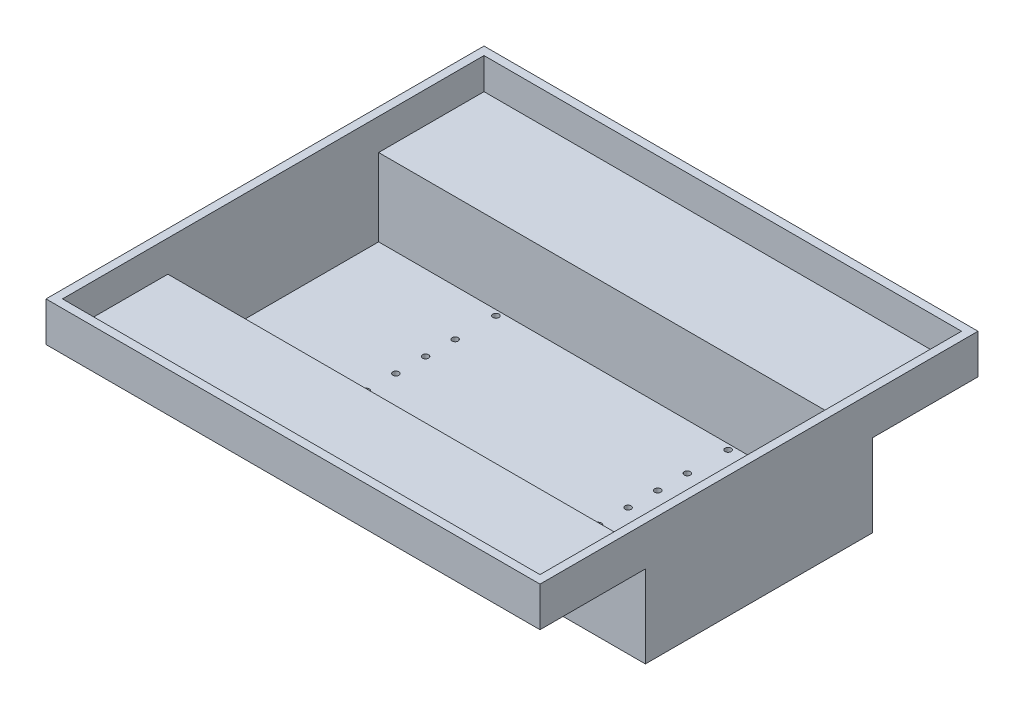
ISO-10303-21;
HEADER;
FILE_DESCRIPTION(('STEP AP214'),'2;1');
FILE_NAME('part.step','',(''),(''),'','','');
FILE_SCHEMA(('AUTOMOTIVE_DESIGN { 1 0 10303 214 1 1 1 1 }'));
ENDSEC;
DATA;
#1=APPLICATION_CONTEXT('core data for automotive mechanical design processes');
#2=APPLICATION_PROTOCOL_DEFINITION('international standard','automotive_design',2000,#1);
#3=PRODUCT_CONTEXT('',#1,'mechanical');
#4=PRODUCT('Part','Part','',(#3));
#5=PRODUCT_RELATED_PRODUCT_CATEGORY('part','',(#4));
#6=PRODUCT_DEFINITION_FORMATION('','',#4);
#7=PRODUCT_DEFINITION_CONTEXT('part definition',#1,'design');
#8=PRODUCT_DEFINITION('design','',#6,#7);
#9=PRODUCT_DEFINITION_SHAPE('','',#8);
#10=(LENGTH_UNIT() NAMED_UNIT(*) SI_UNIT(.MILLI.,.METRE.));
#11=(NAMED_UNIT(*) PLANE_ANGLE_UNIT() SI_UNIT($,.RADIAN.));
#12=(NAMED_UNIT(*) SI_UNIT($,.STERADIAN.) SOLID_ANGLE_UNIT());
#13=UNCERTAINTY_MEASURE_WITH_UNIT(LENGTH_MEASURE(1.E-05),#10,'distance_accuracy_value','');
#14=(GEOMETRIC_REPRESENTATION_CONTEXT(3) GLOBAL_UNCERTAINTY_ASSIGNED_CONTEXT((#13)) GLOBAL_UNIT_ASSIGNED_CONTEXT((#10,
#11,#12)) REPRESENTATION_CONTEXT('',''));
#15=CARTESIAN_POINT('',(0.,0.,0.));
#16=DIRECTION('',(0.,0.,1.));
#17=DIRECTION('',(1.,0.,0.));
#18=AXIS2_PLACEMENT_3D('',#15,#16,#17);
#19=CARTESIAN_POINT('',(150.,-42.,69.));
#20=DIRECTION('',(0.,1.,0.));
#21=DIRECTION('',(0.,0.,1.));
#22=AXIS2_PLACEMENT_3D('',#19,#20,#21);
#23=PLANE('',#22);
#24=CARTESIAN_POINT('',(-70.5000000000003,-42.,36.));
#25=DIRECTION('',(0.,1.,0.));
#26=DIRECTION('',(0.,0.,1.));
#27=AXIS2_PLACEMENT_3D('',#24,#25,#26);
#28=CIRCLE('',#27,1.85000000000001);
#29=CARTESIAN_POINT('',(-70.5000000000003,-42.,37.85));
#30=VERTEX_POINT('',#29);
#31=EDGE_CURVE('E45',#30,#30,#28,.T.);
#32=ORIENTED_EDGE('',*,*,#31,.F.);
#33=EDGE_LOOP('',(#32));
#34=FACE_BOUND('',#33,.T.);
#35=CARTESIAN_POINT('',(-70.5,-42.,60.75));
#36=DIRECTION('',(0.,1.,0.));
#37=DIRECTION('',(0.,0.,1.));
#38=AXIS2_PLACEMENT_3D('',#35,#36,#37);
#39=CIRCLE('',#38,1.85000000000001);
#40=CARTESIAN_POINT('',(-70.5,-42.,62.6));
#41=VERTEX_POINT('',#40);
#42=EDGE_CURVE('E351',#41,#41,#39,.T.);
#43=ORIENTED_EDGE('',*,*,#42,.F.);
#44=EDGE_LOOP('',(#43));
#45=FACE_BOUND('',#44,.T.);
#46=CARTESIAN_POINT('',(70.5,-42.,-60.75));
#47=DIRECTION('',(0.,1.,0.));
#48=DIRECTION('',(0.,0.,1.));
#49=AXIS2_PLACEMENT_3D('',#46,#47,#48);
#50=CIRCLE('',#49,1.85000000000001);
#51=CARTESIAN_POINT('',(70.5,-42.,-58.9));
#52=VERTEX_POINT('',#51);
#53=EDGE_CURVE('E348',#52,#52,#50,.T.);
#54=ORIENTED_EDGE('',*,*,#53,.F.);
#55=EDGE_LOOP('',(#54));
#56=FACE_BOUND('',#55,.T.);
#57=CARTESIAN_POINT('',(70.5000000000004,-42.,36.));
#58=DIRECTION('',(0.,1.,0.));
#59=DIRECTION('',(0.,0.,1.));
#60=AXIS2_PLACEMENT_3D('',#57,#58,#59);
#61=CIRCLE('',#60,1.85000000000001);
#62=CARTESIAN_POINT('',(70.5000000000004,-42.,37.85));
#63=VERTEX_POINT('',#62);
#64=EDGE_CURVE('E344',#63,#63,#61,.T.);
#65=ORIENTED_EDGE('',*,*,#64,.F.);
#66=EDGE_LOOP('',(#65));
#67=FACE_BOUND('',#66,.T.);
#68=CARTESIAN_POINT('',(70.5,-42.,60.75));
#69=DIRECTION('',(0.,1.,0.));
#70=DIRECTION('',(0.,0.,1.));
#71=AXIS2_PLACEMENT_3D('',#68,#69,#70);
#72=CIRCLE('',#71,1.85000000000001);
#73=CARTESIAN_POINT('',(70.5,-42.,62.6));
#74=VERTEX_POINT('',#73);
#75=EDGE_CURVE('E340',#74,#74,#72,.T.);
#76=ORIENTED_EDGE('',*,*,#75,.F.);
#77=EDGE_LOOP('',(#76));
#78=FACE_BOUND('',#77,.T.);
#79=CARTESIAN_POINT('',(70.4999999999999,-42.,-18.));
#80=DIRECTION('',(0.,1.,0.));
#81=DIRECTION('',(0.,0.,1.));
#82=AXIS2_PLACEMENT_3D('',#79,#80,#81);
#83=CIRCLE('',#82,1.85);
#84=CARTESIAN_POINT('',(70.4999999999999,-42.,-16.15));
#85=VERTEX_POINT('',#84);
#86=EDGE_CURVE('E336',#85,#85,#83,.T.);
#87=ORIENTED_EDGE('',*,*,#86,.F.);
#88=EDGE_LOOP('',(#87));
#89=FACE_BOUND('',#88,.T.);
#90=CARTESIAN_POINT('',(70.4999999999999,-42.,-36.));
#91=DIRECTION('',(0.,1.,0.));
#92=DIRECTION('',(0.,0.,1.));
#93=AXIS2_PLACEMENT_3D('',#90,#91,#92);
#94=CIRCLE('',#93,1.85000000000001);
#95=CARTESIAN_POINT('',(70.4999999999999,-42.,-34.15));
#96=VERTEX_POINT('',#95);
#97=EDGE_CURVE('E332',#96,#96,#94,.T.);
#98=ORIENTED_EDGE('',*,*,#97,.F.);
#99=EDGE_LOOP('',(#98));
#100=FACE_BOUND('',#99,.T.);
#101=CARTESIAN_POINT('',(70.5000000000002,-42.,18.));
#102=DIRECTION('',(0.,1.,0.));
#103=DIRECTION('',(0.,0.,1.));
#104=AXIS2_PLACEMENT_3D('',#101,#102,#103);
#105=CIRCLE('',#104,1.85);
#106=CARTESIAN_POINT('',(70.5000000000002,-42.,19.85));
#107=VERTEX_POINT('',#106);
#108=EDGE_CURVE('E328',#107,#107,#105,.T.);
#109=ORIENTED_EDGE('',*,*,#108,.F.);
#110=EDGE_LOOP('',(#109));
#111=FACE_BOUND('',#110,.T.);
#112=CARTESIAN_POINT('',(-70.5000000000002,-42.,18.));
#113=DIRECTION('',(0.,1.,0.));
#114=DIRECTION('',(0.,0.,1.));
#115=AXIS2_PLACEMENT_3D('',#112,#113,#114);
#116=CIRCLE('',#115,1.85);
#117=CARTESIAN_POINT('',(-70.5000000000002,-42.,19.85));
#118=VERTEX_POINT('',#117);
#119=EDGE_CURVE('E324',#118,#118,#116,.T.);
#120=ORIENTED_EDGE('',*,*,#119,.F.);
#121=EDGE_LOOP('',(#120));
#122=FACE_BOUND('',#121,.T.);
#123=CARTESIAN_POINT('',(-70.5,-42.,0.));
#124=DIRECTION('',(0.,1.,0.));
#125=DIRECTION('',(0.,0.,1.));
#126=AXIS2_PLACEMENT_3D('',#123,#124,#125);
#127=CIRCLE('',#126,1.85);
#128=CARTESIAN_POINT('',(-70.5,-42.,1.85));
#129=VERTEX_POINT('',#128);
#130=EDGE_CURVE('E320',#129,#129,#127,.T.);
#131=ORIENTED_EDGE('',*,*,#130,.F.);
#132=EDGE_LOOP('',(#131));
#133=FACE_BOUND('',#132,.T.);
#134=CARTESIAN_POINT('',(-70.4999999999999,-42.,-18.));
#135=DIRECTION('',(0.,1.,0.));
#136=DIRECTION('',(0.,0.,1.));
#137=AXIS2_PLACEMENT_3D('',#134,#135,#136);
#138=CIRCLE('',#137,1.85);
#139=CARTESIAN_POINT('',(-70.4999999999999,-42.,-16.15));
#140=VERTEX_POINT('',#139);
#141=EDGE_CURVE('E316',#140,#140,#138,.T.);
#142=ORIENTED_EDGE('',*,*,#141,.F.);
#143=EDGE_LOOP('',(#142));
#144=FACE_BOUND('',#143,.T.);
#145=CARTESIAN_POINT('',(-70.4999999999998,-42.,-36.));
#146=DIRECTION('',(0.,1.,0.));
#147=DIRECTION('',(0.,0.,1.));
#148=AXIS2_PLACEMENT_3D('',#145,#146,#147);
#149=CIRCLE('',#148,1.85000000000001);
#150=CARTESIAN_POINT('',(-70.4999999999998,-42.,-34.15));
#151=VERTEX_POINT('',#150);
#152=EDGE_CURVE('E312',#151,#151,#149,.T.);
#153=ORIENTED_EDGE('',*,*,#152,.F.);
#154=EDGE_LOOP('',(#153));
#155=FACE_BOUND('',#154,.T.);
#156=CARTESIAN_POINT('',(-70.5,-42.,-60.75));
#157=DIRECTION('',(0.,1.,0.));
#158=DIRECTION('',(0.,0.,1.));
#159=AXIS2_PLACEMENT_3D('',#156,#157,#158);
#160=CIRCLE('',#159,1.85000000000001);
#161=CARTESIAN_POINT('',(-70.5,-42.,-58.9));
#162=VERTEX_POINT('',#161);
#163=EDGE_CURVE('E307',#162,#162,#160,.T.);
#164=ORIENTED_EDGE('',*,*,#163,.F.);
#165=EDGE_LOOP('',(#164));
#166=FACE_BOUND('',#165,.T.);
#167=CARTESIAN_POINT('',(70.5,-42.,0.));
#168=DIRECTION('',(0.,1.,0.));
#169=DIRECTION('',(0.,0.,1.));
#170=AXIS2_PLACEMENT_3D('',#167,#168,#169);
#171=CIRCLE('',#170,1.85);
#172=CARTESIAN_POINT('',(70.5,-42.,1.85));
#173=VERTEX_POINT('',#172);
#174=EDGE_CURVE('E303',#173,#173,#171,.T.);
#175=ORIENTED_EDGE('',*,*,#174,.F.);
#176=EDGE_LOOP('',(#175));
#177=FACE_BOUND('',#176,.T.);
#178=DIRECTION('',(0.,0.,-1.));
#179=VECTOR('',#178,1.);
#180=CARTESIAN_POINT('',(-145.,-42.,0.));
#181=LINE('',#180,#179);
#182=CARTESIAN_POINT('',(-145.,-42.,64.));
#183=VERTEX_POINT('',#182);
#184=CARTESIAN_POINT('',(-145.,-42.,-64.));
#185=VERTEX_POINT('',#184);
#186=EDGE_CURVE('E242',#183,#185,#181,.T.);
#187=ORIENTED_EDGE('',*,*,#186,.F.);
#188=DIRECTION('',(-1.,0.,0.));
#189=VECTOR('',#188,1.);
#190=CARTESIAN_POINT('',(150.,-42.,64.));
#191=LINE('',#190,#189);
#192=CARTESIAN_POINT('',(145.,-42.,64.));
#193=VERTEX_POINT('',#192);
#194=EDGE_CURVE('E297',#193,#183,#191,.T.);
#195=ORIENTED_EDGE('',*,*,#194,.F.);
#196=DIRECTION('',(0.,0.,-1.));
#197=VECTOR('',#196,1.);
#198=CARTESIAN_POINT('',(145.,-42.,0.));
#199=LINE('',#198,#197);
#200=CARTESIAN_POINT('',(145.,-42.,-64.));
#201=VERTEX_POINT('',#200);
#202=EDGE_CURVE('E259',#193,#201,#199,.T.);
#203=ORIENTED_EDGE('',*,*,#202,.T.);
#204=DIRECTION('',(-1.,0.,0.));
#205=VECTOR('',#204,1.);
#206=CARTESIAN_POINT('',(150.,-42.,-64.));
#207=LINE('',#206,#205);
#208=EDGE_CURVE('E292',#201,#185,#207,.T.);
#209=ORIENTED_EDGE('',*,*,#208,.T.);
#210=EDGE_LOOP('',(#187,#195,#203,#209));
#211=FACE_BOUND('',#210,.T.);
#212=ADVANCED_FACE('F41',(#34,#45,#56,#67,#78,#89,#100,#111,#122,#133,#144,#155,#166,#177,#211),
#23,.T.);
#213=CARTESIAN_POINT('',(150.,0.,-64.));
#214=DIRECTION('',(0.,0.,1.));
#215=DIRECTION('',(1.,0.,0.));
#216=AXIS2_PLACEMENT_3D('',#213,#214,#215);
#217=PLANE('',#216);
#218=DIRECTION('',(0.,1.,0.));
#219=VECTOR('',#218,1.);
#220=CARTESIAN_POINT('',(-145.,0.,-64.));
#221=LINE('',#220,#219);
#222=CARTESIAN_POINT('',(-145.,5.00000000000006,-64.));
#223=VERTEX_POINT('',#222);
#224=EDGE_CURVE('E68',#185,#223,#221,.T.);
#225=ORIENTED_EDGE('',*,*,#224,.F.);
#226=ORIENTED_EDGE('',*,*,#208,.F.);
#227=DIRECTION('',(0.,1.,0.));
#228=VECTOR('',#227,1.);
#229=CARTESIAN_POINT('',(145.,0.,-64.));
#230=LINE('',#229,#228);
#231=CARTESIAN_POINT('',(145.,5.00000000000006,-64.));
#232=VERTEX_POINT('',#231);
#233=EDGE_CURVE('E256',#201,#232,#230,.T.);
#234=ORIENTED_EDGE('',*,*,#233,.T.);
#235=DIRECTION('',(-1.,0.,0.));
#236=VECTOR('',#235,1.);
#237=CARTESIAN_POINT('',(150.,5.00000000000006,-64.));
#238=LINE('',#237,#236);
#239=EDGE_CURVE('E286',#232,#223,#238,.T.);
#240=ORIENTED_EDGE('',*,*,#239,.T.);
#241=EDGE_LOOP('',(#225,#226,#234,#240));
#242=FACE_BOUND('',#241,.T.);
#243=ADVANCED_FACE('F365',(#242),#217,.T.);
#244=CARTESIAN_POINT('',(150.,5.00000000000005,-69.));
#245=DIRECTION('',(0.,1.,0.));
#246=DIRECTION('',(0.,0.,1.));
#247=AXIS2_PLACEMENT_3D('',#244,#245,#246);
#248=PLANE('',#247);
#249=DIRECTION('',(0.,0.,-1.));
#250=VECTOR('',#249,1.);
#251=CARTESIAN_POINT('',(-145.,5.00000000000011,0.));
#252=LINE('',#251,#250);
#253=CARTESIAN_POINT('',(-145.,5.00000000000001,-128.));
#254=VERTEX_POINT('',#253);
#255=EDGE_CURVE('E289',#223,#254,#252,.T.);
#256=ORIENTED_EDGE('',*,*,#255,.F.);
#257=ORIENTED_EDGE('',*,*,#239,.F.);
#258=DIRECTION('',(0.,0.,-1.));
#259=VECTOR('',#258,1.);
#260=CARTESIAN_POINT('',(145.,5.00000000000011,0.));
#261=LINE('',#260,#259);
#262=CARTESIAN_POINT('',(145.,5.00000000000001,-128.));
#263=VERTEX_POINT('',#262);
#264=EDGE_CURVE('E253',#232,#263,#261,.T.);
#265=ORIENTED_EDGE('',*,*,#264,.T.);
#266=DIRECTION('',(-1.,0.,0.));
#267=VECTOR('',#266,1.);
#268=CARTESIAN_POINT('',(150.,5.00000000000001,-128.));
#269=LINE('',#268,#267);
#270=EDGE_CURVE('E278',#263,#254,#269,.T.);
#271=ORIENTED_EDGE('',*,*,#270,.T.);
#272=EDGE_LOOP('',(#256,#257,#265,#271));
#273=FACE_BOUND('',#272,.T.);
#274=ADVANCED_FACE('F409',(#273),#248,.T.);
#275=CARTESIAN_POINT('',(150.,0.,-128.));
#276=DIRECTION('',(0.,0.,1.));
#277=DIRECTION('',(1.,0.,0.));
#278=AXIS2_PLACEMENT_3D('',#275,#276,#277);
#279=PLANE('',#278);
#280=DIRECTION('',(0.,1.,0.));
#281=VECTOR('',#280,1.);
#282=CARTESIAN_POINT('',(-145.,0.,-128.));
#283=LINE('',#282,#281);
#284=CARTESIAN_POINT('',(-145.,24.,-128.));
#285=VERTEX_POINT('',#284);
#286=EDGE_CURVE('E282',#254,#285,#283,.T.);
#287=ORIENTED_EDGE('',*,*,#286,.F.);
#288=ORIENTED_EDGE('',*,*,#270,.F.);
#289=DIRECTION('',(0.,1.,0.));
#290=VECTOR('',#289,1.);
#291=CARTESIAN_POINT('',(145.,0.,-128.));
#292=LINE('',#291,#290);
#293=CARTESIAN_POINT('',(145.,24.,-128.));
#294=VERTEX_POINT('',#293);
#295=EDGE_CURVE('E249',#263,#294,#292,.T.);
#296=ORIENTED_EDGE('',*,*,#295,.T.);
#297=DIRECTION('',(-1.,0.,0.));
#298=VECTOR('',#297,1.);
#299=CARTESIAN_POINT('',(-145.,24.,-128.));
#300=LINE('',#299,#298);
#301=EDGE_CURVE('E421',#294,#285,#300,.T.);
#302=ORIENTED_EDGE('',*,*,#301,.T.);
#303=EDGE_LOOP('',(#287,#288,#296,#302));
#304=FACE_BOUND('',#303,.T.);
#305=ADVANCED_FACE('F420',(#304),#279,.T.);
#306=CARTESIAN_POINT('',(150.,0.,128.));
#307=DIRECTION('',(0.,0.,-1.));
#308=DIRECTION('',(-1.,0.,0.));
#309=AXIS2_PLACEMENT_3D('',#306,#307,#308);
#310=PLANE('',#309);
#311=DIRECTION('',(0.,-1.,0.));
#312=VECTOR('',#311,1.);
#313=CARTESIAN_POINT('',(-145.,0.,128.));
#314=LINE('',#313,#312);
#315=CARTESIAN_POINT('',(-145.,24.,128.));
#316=VERTEX_POINT('',#315);
#317=CARTESIAN_POINT('',(-145.,4.99999999999998,128.));
#318=VERTEX_POINT('',#317);
#319=EDGE_CURVE('E59',#316,#318,#314,.T.);
#320=ORIENTED_EDGE('',*,*,#319,.F.);
#321=DIRECTION('',(1.,0.,0.));
#322=VECTOR('',#321,1.);
#323=CARTESIAN_POINT('',(145.,24.,128.));
#324=LINE('',#323,#322);
#325=CARTESIAN_POINT('',(145.,24.,128.));
#326=VERTEX_POINT('',#325);
#327=EDGE_CURVE('E427',#316,#326,#324,.T.);
#328=ORIENTED_EDGE('',*,*,#327,.T.);
#329=DIRECTION('',(0.,-1.,0.));
#330=VECTOR('',#329,1.);
#331=CARTESIAN_POINT('',(145.,0.,128.));
#332=LINE('',#331,#330);
#333=CARTESIAN_POINT('',(145.,4.99999999999998,128.));
#334=VERTEX_POINT('',#333);
#335=EDGE_CURVE('E246',#326,#334,#332,.T.);
#336=ORIENTED_EDGE('',*,*,#335,.T.);
#337=DIRECTION('',(-1.,0.,0.));
#338=VECTOR('',#337,1.);
#339=CARTESIAN_POINT('',(150.,4.99999999999998,128.));
#340=LINE('',#339,#338);
#341=EDGE_CURVE('E270',#334,#318,#340,.T.);
#342=ORIENTED_EDGE('',*,*,#341,.T.);
#343=EDGE_LOOP('',(#320,#328,#336,#342));
#344=FACE_BOUND('',#343,.T.);
#345=ADVANCED_FACE('F428',(#344),#310,.T.);
#346=CARTESIAN_POINT('',(150.,5.00000000000001,69.));
#347=DIRECTION('',(0.,1.,0.));
#348=DIRECTION('',(0.,0.,1.));
#349=AXIS2_PLACEMENT_3D('',#346,#347,#348);
#350=PLANE('',#349);
#351=DIRECTION('',(0.,0.,-1.));
#352=VECTOR('',#351,1.);
#353=CARTESIAN_POINT('',(-145.,5.00000000000005,0.));
#354=LINE('',#353,#352);
#355=CARTESIAN_POINT('',(-145.,5.00000000000002,64.));
#356=VERTEX_POINT('',#355);
#357=EDGE_CURVE('E273',#318,#356,#354,.T.);
#358=ORIENTED_EDGE('',*,*,#357,.F.);
#359=ORIENTED_EDGE('',*,*,#341,.F.);
#360=DIRECTION('',(0.,0.,-1.));
#361=VECTOR('',#360,1.);
#362=CARTESIAN_POINT('',(145.,5.00000000000005,0.));
#363=LINE('',#362,#361);
#364=CARTESIAN_POINT('',(145.,5.00000000000002,64.));
#365=VERTEX_POINT('',#364);
#366=EDGE_CURVE('E51',#334,#365,#363,.T.);
#367=ORIENTED_EDGE('',*,*,#366,.T.);
#368=DIRECTION('',(-1.,0.,0.));
#369=VECTOR('',#368,1.);
#370=CARTESIAN_POINT('',(150.,5.00000000000002,64.));
#371=LINE('',#370,#369);
#372=EDGE_CURVE('E263',#365,#356,#371,.T.);
#373=ORIENTED_EDGE('',*,*,#372,.T.);
#374=EDGE_LOOP('',(#358,#359,#367,#373));
#375=FACE_BOUND('',#374,.T.);
#376=ADVANCED_FACE('F557',(#375),#350,.T.);
#377=CARTESIAN_POINT('',(150.,0.,64.));
#378=DIRECTION('',(0.,0.,-1.));
#379=DIRECTION('',(-1.,0.,0.));
#380=AXIS2_PLACEMENT_3D('',#377,#378,#379);
#381=PLANE('',#380);
#382=DIRECTION('',(0.,-1.,0.));
#383=VECTOR('',#382,1.);
#384=CARTESIAN_POINT('',(-145.,0.,64.));
#385=LINE('',#384,#383);
#386=EDGE_CURVE('E267',#356,#183,#385,.T.);
#387=ORIENTED_EDGE('',*,*,#386,.F.);
#388=ORIENTED_EDGE('',*,*,#372,.F.);
#389=DIRECTION('',(0.,-1.,0.));
#390=VECTOR('',#389,1.);
#391=CARTESIAN_POINT('',(145.,0.,64.));
#392=LINE('',#391,#390);
#393=EDGE_CURVE('E11',#365,#193,#392,.T.);
#394=ORIENTED_EDGE('',*,*,#393,.T.);
#395=ORIENTED_EDGE('',*,*,#194,.T.);
#396=EDGE_LOOP('',(#387,#388,#394,#395));
#397=FACE_BOUND('',#396,.T.);
#398=ADVANCED_FACE('F399',(#397),#381,.T.);
#399=CARTESIAN_POINT('',(145.,0.,0.));
#400=DIRECTION('',(-1.,0.,0.));
#401=DIRECTION('',(0.,0.,1.));
#402=AXIS2_PLACEMENT_3D('',#399,#400,#401);
#403=PLANE('',#402);
#404=ORIENTED_EDGE('',*,*,#202,.F.);
#405=ORIENTED_EDGE('',*,*,#393,.F.);
#406=ORIENTED_EDGE('',*,*,#366,.F.);
#407=ORIENTED_EDGE('',*,*,#335,.F.);
#408=DIRECTION('',(0.,0.,-1.));
#409=VECTOR('',#408,1.);
#410=CARTESIAN_POINT('',(145.,24.,-128.));
#411=LINE('',#410,#409);
#412=EDGE_CURVE('E415',#326,#294,#411,.T.);
#413=ORIENTED_EDGE('',*,*,#412,.T.);
#414=ORIENTED_EDGE('',*,*,#295,.F.);
#415=ORIENTED_EDGE('',*,*,#264,.F.);
#416=ORIENTED_EDGE('',*,*,#233,.F.);
#417=EDGE_LOOP('',(#404,#405,#406,#407,#413,#414,#415,#416));
#418=FACE_BOUND('',#417,.T.);
#419=ADVANCED_FACE('F403',(#418),#403,.T.);
#420=CARTESIAN_POINT('',(-145.,0.,0.));
#421=DIRECTION('',(-1.,0.,0.));
#422=DIRECTION('',(0.,0.,1.));
#423=AXIS2_PLACEMENT_3D('',#420,#421,#422);
#424=PLANE('',#423);
#425=ORIENTED_EDGE('',*,*,#186,.T.);
#426=ORIENTED_EDGE('',*,*,#224,.T.);
#427=ORIENTED_EDGE('',*,*,#255,.T.);
#428=ORIENTED_EDGE('',*,*,#286,.T.);
#429=DIRECTION('',(0.,0.,1.));
#430=VECTOR('',#429,1.);
#431=CARTESIAN_POINT('',(-145.,24.,128.));
#432=LINE('',#431,#430);
#433=EDGE_CURVE('E431',#285,#316,#432,.T.);
#434=ORIENTED_EDGE('',*,*,#433,.T.);
#435=ORIENTED_EDGE('',*,*,#319,.T.);
#436=ORIENTED_EDGE('',*,*,#357,.T.);
#437=ORIENTED_EDGE('',*,*,#386,.T.);
#438=EDGE_LOOP('',(#425,#426,#427,#428,#434,#435,#436,#437));
#439=FACE_BOUND('',#438,.T.);
#440=ADVANCED_FACE('F43',(#439),#424,.F.);
#441=CARTESIAN_POINT('',(70.5,-50.,0.));
#442=DIRECTION('',(0.,1.,0.));
#443=DIRECTION('',(0.,0.,1.));
#444=AXIS2_PLACEMENT_3D('',#441,#442,#443);
#445=CYLINDRICAL_SURFACE('',#444,1.85);
#446=ORIENTED_EDGE('',*,*,#174,.T.);
#447=EDGE_LOOP('',(#446));
#448=FACE_BOUND('',#447,.T.);
#449=CARTESIAN_POINT('',(70.5,-50.,0.));
#450=DIRECTION('',(0.,1.,0.));
#451=DIRECTION('',(0.,0.,1.));
#452=AXIS2_PLACEMENT_3D('',#449,#450,#451);
#453=CIRCLE('',#452,1.85);
#454=CARTESIAN_POINT('',(70.5,-50.,1.85));
#455=VERTEX_POINT('',#454);
#456=EDGE_CURVE('E308',#455,#455,#453,.T.);
#457=ORIENTED_EDGE('',*,*,#456,.F.);
#458=EDGE_LOOP('',(#457));
#459=FACE_BOUND('',#458,.T.);
#460=ADVANCED_FACE('F566',(#448,#459),#445,.F.);
#461=CARTESIAN_POINT('',(-70.5,-50.,-60.75));
#462=DIRECTION('',(0.,1.,0.));
#463=DIRECTION('',(0.,0.,1.));
#464=AXIS2_PLACEMENT_3D('',#461,#462,#463);
#465=CYLINDRICAL_SURFACE('',#464,1.85000000000001);
#466=ORIENTED_EDGE('',*,*,#163,.T.);
#467=EDGE_LOOP('',(#466));
#468=FACE_BOUND('',#467,.T.);
#469=CARTESIAN_POINT('',(-70.5,-50.,-60.75));
#470=DIRECTION('',(0.,1.,0.));
#471=DIRECTION('',(0.,0.,-1.));
#472=AXIS2_PLACEMENT_3D('',#469,#470,#471);
#473=CIRCLE('',#472,1.85000000000001);
#474=CARTESIAN_POINT('',(-70.5,-50.,-62.6));
#475=VERTEX_POINT('',#474);
#476=EDGE_CURVE('E438',#475,#475,#473,.T.);
#477=ORIENTED_EDGE('',*,*,#476,.F.);
#478=EDGE_LOOP('',(#477));
#479=FACE_BOUND('',#478,.T.);
#480=ADVANCED_FACE('F570',(#468,#479),#465,.F.);
#481=CARTESIAN_POINT('',(-70.4999999999998,-50.,-36.));
#482=DIRECTION('',(0.,1.,0.));
#483=DIRECTION('',(0.,0.,1.));
#484=AXIS2_PLACEMENT_3D('',#481,#482,#483);
#485=CYLINDRICAL_SURFACE('',#484,1.85000000000001);
#486=ORIENTED_EDGE('',*,*,#152,.T.);
#487=EDGE_LOOP('',(#486));
#488=FACE_BOUND('',#487,.T.);
#489=CARTESIAN_POINT('',(-70.4999999999998,-50.,-36.));
#490=DIRECTION('',(0.,1.,0.));
#491=DIRECTION('',(0.,0.,-1.));
#492=AXIS2_PLACEMENT_3D('',#489,#490,#491);
#493=CIRCLE('',#492,1.85000000000001);
#494=CARTESIAN_POINT('',(-70.4999999999998,-50.,-37.85));
#495=VERTEX_POINT('',#494);
#496=EDGE_CURVE('E455',#495,#495,#493,.T.);
#497=ORIENTED_EDGE('',*,*,#496,.F.);
#498=EDGE_LOOP('',(#497));
#499=FACE_BOUND('',#498,.T.);
#500=ADVANCED_FACE('F576',(#488,#499),#485,.F.);
#501=CARTESIAN_POINT('',(-70.4999999999999,-50.,-18.));
#502=DIRECTION('',(0.,1.,0.));
#503=DIRECTION('',(0.,0.,1.));
#504=AXIS2_PLACEMENT_3D('',#501,#502,#503);
#505=CYLINDRICAL_SURFACE('',#504,1.85);
#506=ORIENTED_EDGE('',*,*,#141,.T.);
#507=EDGE_LOOP('',(#506));
#508=FACE_BOUND('',#507,.T.);
#509=CARTESIAN_POINT('',(-70.4999999999999,-50.,-18.));
#510=DIRECTION('',(0.,1.,0.));
#511=DIRECTION('',(0.,0.,-1.));
#512=AXIS2_PLACEMENT_3D('',#509,#510,#511);
#513=CIRCLE('',#512,1.85);
#514=CARTESIAN_POINT('',(-70.4999999999999,-50.,-19.85));
#515=VERTEX_POINT('',#514);
#516=EDGE_CURVE('E451',#515,#515,#513,.T.);
#517=ORIENTED_EDGE('',*,*,#516,.F.);
#518=EDGE_LOOP('',(#517));
#519=FACE_BOUND('',#518,.T.);
#520=ADVANCED_FACE('F613',(#508,#519),#505,.F.);
#521=CARTESIAN_POINT('',(-70.5,-50.,0.));
#522=DIRECTION('',(0.,1.,0.));
#523=DIRECTION('',(0.,0.,1.));
#524=AXIS2_PLACEMENT_3D('',#521,#522,#523);
#525=CYLINDRICAL_SURFACE('',#524,1.85);
#526=ORIENTED_EDGE('',*,*,#130,.T.);
#527=EDGE_LOOP('',(#526));
#528=FACE_BOUND('',#527,.T.);
#529=CARTESIAN_POINT('',(-70.5,-50.,0.));
#530=DIRECTION('',(0.,1.,0.));
#531=DIRECTION('',(0.,0.,-1.));
#532=AXIS2_PLACEMENT_3D('',#529,#530,#531);
#533=CIRCLE('',#532,1.85);
#534=CARTESIAN_POINT('',(-70.5,-50.,-1.85));
#535=VERTEX_POINT('',#534);
#536=EDGE_CURVE('E447',#535,#535,#533,.T.);
#537=ORIENTED_EDGE('',*,*,#536,.F.);
#538=EDGE_LOOP('',(#537));
#539=FACE_BOUND('',#538,.T.);
#540=ADVANCED_FACE('F617',(#528,#539),#525,.F.);
#541=CARTESIAN_POINT('',(-70.5000000000002,-50.,18.));
#542=DIRECTION('',(0.,1.,0.));
#543=DIRECTION('',(0.,0.,1.));
#544=AXIS2_PLACEMENT_3D('',#541,#542,#543);
#545=CYLINDRICAL_SURFACE('',#544,1.85);
#546=ORIENTED_EDGE('',*,*,#119,.T.);
#547=EDGE_LOOP('',(#546));
#548=FACE_BOUND('',#547,.T.);
#549=CARTESIAN_POINT('',(-70.5000000000002,-50.,18.));
#550=DIRECTION('',(0.,1.,0.));
#551=DIRECTION('',(0.,0.,-1.));
#552=AXIS2_PLACEMENT_3D('',#549,#550,#551);
#553=CIRCLE('',#552,1.85);
#554=CARTESIAN_POINT('',(-70.5000000000002,-50.,16.15));
#555=VERTEX_POINT('',#554);
#556=EDGE_CURVE('E442',#555,#555,#553,.T.);
#557=ORIENTED_EDGE('',*,*,#556,.F.);
#558=EDGE_LOOP('',(#557));
#559=FACE_BOUND('',#558,.T.);
#560=ADVANCED_FACE('F594',(#548,#559),#545,.F.);
#561=CARTESIAN_POINT('',(70.5000000000002,-50.,18.));
#562=DIRECTION('',(0.,1.,0.));
#563=DIRECTION('',(0.,0.,1.));
#564=AXIS2_PLACEMENT_3D('',#561,#562,#563);
#565=CYLINDRICAL_SURFACE('',#564,1.85);
#566=ORIENTED_EDGE('',*,*,#108,.T.);
#567=EDGE_LOOP('',(#566));
#568=FACE_BOUND('',#567,.T.);
#569=CARTESIAN_POINT('',(70.5000000000002,-50.,18.));
#570=DIRECTION('',(0.,1.,0.));
#571=DIRECTION('',(0.,0.,1.));
#572=AXIS2_PLACEMENT_3D('',#569,#570,#571);
#573=CIRCLE('',#572,1.85);
#574=CARTESIAN_POINT('',(70.5000000000002,-50.,19.85));
#575=VERTEX_POINT('',#574);
#576=EDGE_CURVE('E466',#575,#575,#573,.T.);
#577=ORIENTED_EDGE('',*,*,#576,.F.);
#578=EDGE_LOOP('',(#577));
#579=FACE_BOUND('',#578,.T.);
#580=ADVANCED_FACE('F591',(#568,#579),#565,.F.);
#581=CARTESIAN_POINT('',(70.4999999999999,-50.,-36.));
#582=DIRECTION('',(0.,1.,0.));
#583=DIRECTION('',(0.,0.,1.));
#584=AXIS2_PLACEMENT_3D('',#581,#582,#583);
#585=CYLINDRICAL_SURFACE('',#584,1.85000000000001);
#586=ORIENTED_EDGE('',*,*,#97,.T.);
#587=EDGE_LOOP('',(#586));
#588=FACE_BOUND('',#587,.T.);
#589=CARTESIAN_POINT('',(70.4999999999999,-50.,-36.));
#590=DIRECTION('',(0.,1.,0.));
#591=DIRECTION('',(0.,0.,1.));
#592=AXIS2_PLACEMENT_3D('',#589,#590,#591);
#593=CIRCLE('',#592,1.85000000000001);
#594=CARTESIAN_POINT('',(70.4999999999999,-50.,-34.15));
#595=VERTEX_POINT('',#594);
#596=EDGE_CURVE('E478',#595,#595,#593,.T.);
#597=ORIENTED_EDGE('',*,*,#596,.F.);
#598=EDGE_LOOP('',(#597));
#599=FACE_BOUND('',#598,.T.);
#600=ADVANCED_FACE('F585',(#588,#599),#585,.F.);
#601=CARTESIAN_POINT('',(70.4999999999999,-50.,-18.));
#602=DIRECTION('',(0.,1.,0.));
#603=DIRECTION('',(0.,0.,1.));
#604=AXIS2_PLACEMENT_3D('',#601,#602,#603);
#605=CYLINDRICAL_SURFACE('',#604,1.85);
#606=ORIENTED_EDGE('',*,*,#86,.T.);
#607=EDGE_LOOP('',(#606));
#608=FACE_BOUND('',#607,.T.);
#609=CARTESIAN_POINT('',(70.4999999999999,-50.,-18.));
#610=DIRECTION('',(0.,1.,0.));
#611=DIRECTION('',(0.,0.,1.));
#612=AXIS2_PLACEMENT_3D('',#609,#610,#611);
#613=CIRCLE('',#612,1.85);
#614=CARTESIAN_POINT('',(70.4999999999999,-50.,-16.15));
#615=VERTEX_POINT('',#614);
#616=EDGE_CURVE('E482',#615,#615,#613,.T.);
#617=ORIENTED_EDGE('',*,*,#616,.F.);
#618=EDGE_LOOP('',(#617));
#619=FACE_BOUND('',#618,.T.);
#620=ADVANCED_FACE('F581',(#608,#619),#605,.F.);
#621=CARTESIAN_POINT('',(70.5,-50.,60.75));
#622=DIRECTION('',(0.,1.,0.));
#623=DIRECTION('',(0.,0.,1.));
#624=AXIS2_PLACEMENT_3D('',#621,#622,#623);
#625=CYLINDRICAL_SURFACE('',#624,1.85000000000001);
#626=ORIENTED_EDGE('',*,*,#75,.T.);
#627=EDGE_LOOP('',(#626));
#628=FACE_BOUND('',#627,.T.);
#629=CARTESIAN_POINT('',(70.5,-50.,60.75));
#630=DIRECTION('',(0.,1.,0.));
#631=DIRECTION('',(0.,0.,1.));
#632=AXIS2_PLACEMENT_3D('',#629,#630,#631);
#633=CIRCLE('',#632,1.85000000000001);
#634=CARTESIAN_POINT('',(70.5,-50.,62.6));
#635=VERTEX_POINT('',#634);
#636=EDGE_CURVE('E486',#635,#635,#633,.T.);
#637=ORIENTED_EDGE('',*,*,#636,.F.);
#638=EDGE_LOOP('',(#637));
#639=FACE_BOUND('',#638,.T.);
#640=ADVANCED_FACE('F584',(#628,#639),#625,.F.);
#641=CARTESIAN_POINT('',(70.5000000000004,-50.,36.));
#642=DIRECTION('',(0.,1.,0.));
#643=DIRECTION('',(0.,0.,1.));
#644=AXIS2_PLACEMENT_3D('',#641,#642,#643);
#645=CYLINDRICAL_SURFACE('',#644,1.85000000000001);
#646=ORIENTED_EDGE('',*,*,#64,.T.);
#647=EDGE_LOOP('',(#646));
#648=FACE_BOUND('',#647,.T.);
#649=CARTESIAN_POINT('',(70.5000000000004,-50.,36.));
#650=DIRECTION('',(0.,1.,0.));
#651=DIRECTION('',(0.,0.,1.));
#652=AXIS2_PLACEMENT_3D('',#649,#650,#651);
#653=CIRCLE('',#652,1.85000000000001);
#654=CARTESIAN_POINT('',(70.5000000000004,-50.,37.85));
#655=VERTEX_POINT('',#654);
#656=EDGE_CURVE('E462',#655,#655,#653,.T.);
#657=ORIENTED_EDGE('',*,*,#656,.F.);
#658=EDGE_LOOP('',(#657));
#659=FACE_BOUND('',#658,.T.);
#660=ADVANCED_FACE('F589',(#648,#659),#645,.F.);
#661=CARTESIAN_POINT('',(70.5,-50.,-60.75));
#662=DIRECTION('',(0.,1.,0.));
#663=DIRECTION('',(0.,0.,1.));
#664=AXIS2_PLACEMENT_3D('',#661,#662,#663);
#665=CYLINDRICAL_SURFACE('',#664,1.85000000000001);
#666=ORIENTED_EDGE('',*,*,#53,.T.);
#667=EDGE_LOOP('',(#666));
#668=FACE_BOUND('',#667,.T.);
#669=CARTESIAN_POINT('',(70.5,-50.,-60.75));
#670=DIRECTION('',(0.,1.,0.));
#671=DIRECTION('',(0.,0.,1.));
#672=AXIS2_PLACEMENT_3D('',#669,#670,#671);
#673=CIRCLE('',#672,1.85000000000001);
#674=CARTESIAN_POINT('',(70.5,-50.,-58.9));
#675=VERTEX_POINT('',#674);
#676=EDGE_CURVE('E467',#675,#675,#673,.T.);
#677=ORIENTED_EDGE('',*,*,#676,.F.);
#678=EDGE_LOOP('',(#677));
#679=FACE_BOUND('',#678,.T.);
#680=ADVANCED_FACE('F604',(#668,#679),#665,.F.);
#681=CARTESIAN_POINT('',(-70.5,-50.,60.75));
#682=DIRECTION('',(0.,1.,0.));
#683=DIRECTION('',(0.,0.,1.));
#684=AXIS2_PLACEMENT_3D('',#681,#682,#683);
#685=CYLINDRICAL_SURFACE('',#684,1.85000000000001);
#686=ORIENTED_EDGE('',*,*,#42,.T.);
#687=EDGE_LOOP('',(#686));
#688=FACE_BOUND('',#687,.T.);
#689=CARTESIAN_POINT('',(-70.5,-50.,60.75));
#690=DIRECTION('',(0.,1.,0.));
#691=DIRECTION('',(0.,0.,-1.));
#692=AXIS2_PLACEMENT_3D('',#689,#690,#691);
#693=CIRCLE('',#692,1.85000000000001);
#694=CARTESIAN_POINT('',(-70.5,-50.,58.9));
#695=VERTEX_POINT('',#694);
#696=EDGE_CURVE('E471',#695,#695,#693,.T.);
#697=ORIENTED_EDGE('',*,*,#696,.F.);
#698=EDGE_LOOP('',(#697));
#699=FACE_BOUND('',#698,.T.);
#700=ADVANCED_FACE('F601',(#688,#699),#685,.F.);
#701=CARTESIAN_POINT('',(-70.5000000000003,-50.,36.));
#702=DIRECTION('',(0.,1.,0.));
#703=DIRECTION('',(0.,0.,1.));
#704=AXIS2_PLACEMENT_3D('',#701,#702,#703);
#705=CYLINDRICAL_SURFACE('',#704,1.85000000000001);
#706=ORIENTED_EDGE('',*,*,#31,.T.);
#707=EDGE_LOOP('',(#706));
#708=FACE_BOUND('',#707,.T.);
#709=CARTESIAN_POINT('',(-70.5000000000003,-50.,36.));
#710=DIRECTION('',(0.,1.,0.));
#711=DIRECTION('',(0.,0.,-1.));
#712=AXIS2_PLACEMENT_3D('',#709,#710,#711);
#713=CIRCLE('',#712,1.85000000000001);
#714=CARTESIAN_POINT('',(-70.5000000000003,-50.,34.15));
#715=VERTEX_POINT('',#714);
#716=EDGE_CURVE('E446',#715,#715,#713,.T.);
#717=ORIENTED_EDGE('',*,*,#716,.F.);
#718=EDGE_LOOP('',(#717));
#719=FACE_BOUND('',#718,.T.);
#720=ADVANCED_FACE('F360',(#708,#719),#705,.F.);
#721=CARTESIAN_POINT('',(150.,-50.,69.));
#722=DIRECTION('',(0.,1.,0.));
#723=DIRECTION('',(0.,0.,1.));
#724=AXIS2_PLACEMENT_3D('',#721,#722,#723);
#725=PLANE('',#724);
#726=ORIENTED_EDGE('',*,*,#716,.T.);
#727=EDGE_LOOP('',(#726));
#728=FACE_BOUND('',#727,.T.);
#729=ORIENTED_EDGE('',*,*,#696,.T.);
#730=EDGE_LOOP('',(#729));
#731=FACE_BOUND('',#730,.T.);
#732=ORIENTED_EDGE('',*,*,#676,.T.);
#733=EDGE_LOOP('',(#732));
#734=FACE_BOUND('',#733,.T.);
#735=ORIENTED_EDGE('',*,*,#656,.T.);
#736=EDGE_LOOP('',(#735));
#737=FACE_BOUND('',#736,.T.);
#738=ORIENTED_EDGE('',*,*,#636,.T.);
#739=EDGE_LOOP('',(#738));
#740=FACE_BOUND('',#739,.T.);
#741=ORIENTED_EDGE('',*,*,#616,.T.);
#742=EDGE_LOOP('',(#741));
#743=FACE_BOUND('',#742,.T.);
#744=ORIENTED_EDGE('',*,*,#596,.T.);
#745=EDGE_LOOP('',(#744));
#746=FACE_BOUND('',#745,.T.);
#747=ORIENTED_EDGE('',*,*,#576,.T.);
#748=EDGE_LOOP('',(#747));
#749=FACE_BOUND('',#748,.T.);
#750=ORIENTED_EDGE('',*,*,#556,.T.);
#751=EDGE_LOOP('',(#750));
#752=FACE_BOUND('',#751,.T.);
#753=ORIENTED_EDGE('',*,*,#536,.T.);
#754=EDGE_LOOP('',(#753));
#755=FACE_BOUND('',#754,.T.);
#756=ORIENTED_EDGE('',*,*,#516,.T.);
#757=EDGE_LOOP('',(#756));
#758=FACE_BOUND('',#757,.T.);
#759=ORIENTED_EDGE('',*,*,#496,.T.);
#760=EDGE_LOOP('',(#759));
#761=FACE_BOUND('',#760,.T.);
#762=ORIENTED_EDGE('',*,*,#476,.T.);
#763=EDGE_LOOP('',(#762));
#764=FACE_BOUND('',#763,.T.);
#765=ORIENTED_EDGE('',*,*,#456,.T.);
#766=EDGE_LOOP('',(#765));
#767=FACE_BOUND('',#766,.T.);
#768=DIRECTION('',(0.,0.,-1.));
#769=VECTOR('',#768,1.);
#770=CARTESIAN_POINT('',(-150.,-50.,69.));
#771=LINE('',#770,#769);
#772=CARTESIAN_POINT('',(-150.,-50.,69.));
#773=VERTEX_POINT('',#772);
#774=CARTESIAN_POINT('',(-150.,-50.,-69.));
#775=VERTEX_POINT('',#774);
#776=EDGE_CURVE('E199',#773,#775,#771,.T.);
#777=ORIENTED_EDGE('',*,*,#776,.T.);
#778=DIRECTION('',(-1.,0.,0.));
#779=VECTOR('',#778,1.);
#780=CARTESIAN_POINT('',(150.,-50.,-69.));
#781=LINE('',#780,#779);
#782=CARTESIAN_POINT('',(150.,-50.,-69.));
#783=VERTEX_POINT('',#782);
#784=EDGE_CURVE('E240',#783,#775,#781,.T.);
#785=ORIENTED_EDGE('',*,*,#784,.F.);
#786=DIRECTION('',(0.,0.,-1.));
#787=VECTOR('',#786,1.);
#788=CARTESIAN_POINT('',(150.,-50.,69.));
#789=LINE('',#788,#787);
#790=CARTESIAN_POINT('',(150.,-50.,69.));
#791=VERTEX_POINT('',#790);
#792=EDGE_CURVE('E221',#791,#783,#789,.T.);
#793=ORIENTED_EDGE('',*,*,#792,.F.);
#794=DIRECTION('',(-1.,0.,0.));
#795=VECTOR('',#794,1.);
#796=CARTESIAN_POINT('',(150.,-50.,69.));
#797=LINE('',#796,#795);
#798=EDGE_CURVE('E195',#791,#773,#797,.T.);
#799=ORIENTED_EDGE('',*,*,#798,.T.);
#800=EDGE_LOOP('',(#777,#785,#793,#799));
#801=FACE_BOUND('',#800,.T.);
#802=ADVANCED_FACE('F520',(#728,#731,#734,#737,#740,#743,#746,#749,#752,#755,#758,#761,#764,
#767,#801),#725,.F.);
#803=CARTESIAN_POINT('',(150.,0.,-69.));
#804=DIRECTION('',(0.,0.,1.));
#805=DIRECTION('',(1.,0.,0.));
#806=AXIS2_PLACEMENT_3D('',#803,#804,#805);
#807=PLANE('',#806);
#808=DIRECTION('',(0.,1.,0.));
#809=VECTOR('',#808,1.);
#810=CARTESIAN_POINT('',(-150.,0.,-69.));
#811=LINE('',#810,#809);
#812=CARTESIAN_POINT('',(-150.,0.,-69.));
#813=VERTEX_POINT('',#812);
#814=EDGE_CURVE('E203',#775,#813,#811,.T.);
#815=ORIENTED_EDGE('',*,*,#814,.T.);
#816=DIRECTION('',(-1.,0.,0.));
#817=VECTOR('',#816,1.);
#818=CARTESIAN_POINT('',(150.,0.,-69.));
#819=LINE('',#818,#817);
#820=CARTESIAN_POINT('',(150.,0.,-69.));
#821=VERTEX_POINT('',#820);
#822=EDGE_CURVE('E236',#821,#813,#819,.T.);
#823=ORIENTED_EDGE('',*,*,#822,.F.);
#824=DIRECTION('',(0.,1.,0.));
#825=VECTOR('',#824,1.);
#826=CARTESIAN_POINT('',(150.,0.,-69.));
#827=LINE('',#826,#825);
#828=EDGE_CURVE('E156',#783,#821,#827,.T.);
#829=ORIENTED_EDGE('',*,*,#828,.F.);
#830=ORIENTED_EDGE('',*,*,#784,.T.);
#831=EDGE_LOOP('',(#815,#823,#829,#830));
#832=FACE_BOUND('',#831,.T.);
#833=ADVANCED_FACE('F542',(#832),#807,.F.);
#834=CARTESIAN_POINT('',(150.,0.,-69.));
#835=DIRECTION('',(0.,1.,0.));
#836=DIRECTION('',(0.,0.,1.));
#837=AXIS2_PLACEMENT_3D('',#834,#835,#836);
#838=PLANE('',#837);
#839=DIRECTION('',(0.,0.,-1.));
#840=VECTOR('',#839,1.);
#841=CARTESIAN_POINT('',(-150.,0.,-69.));
#842=LINE('',#841,#840);
#843=CARTESIAN_POINT('',(-150.,0.,-133.));
#844=VERTEX_POINT('',#843);
#845=EDGE_CURVE('E206',#813,#844,#842,.T.);
#846=ORIENTED_EDGE('',*,*,#845,.T.);
#847=DIRECTION('',(-1.,0.,0.));
#848=VECTOR('',#847,1.);
#849=CARTESIAN_POINT('',(150.,0.,-133.));
#850=LINE('',#849,#848);
#851=CARTESIAN_POINT('',(150.,0.,-133.));
#852=VERTEX_POINT('',#851);
#853=EDGE_CURVE('E232',#852,#844,#850,.T.);
#854=ORIENTED_EDGE('',*,*,#853,.F.);
#855=DIRECTION('',(0.,0.,-1.));
#856=VECTOR('',#855,1.);
#857=CARTESIAN_POINT('',(150.,0.,-69.));
#858=LINE('',#857,#856);
#859=EDGE_CURVE('E500',#821,#852,#858,.T.);
#860=ORIENTED_EDGE('',*,*,#859,.F.);
#861=ORIENTED_EDGE('',*,*,#822,.T.);
#862=EDGE_LOOP('',(#846,#854,#860,#861));
#863=FACE_BOUND('',#862,.T.);
#864=ADVANCED_FACE('F539',(#863),#838,.F.);
#865=CARTESIAN_POINT('',(150.,0.,-133.));
#866=DIRECTION('',(0.,0.,1.));
#867=DIRECTION('',(1.,0.,0.));
#868=AXIS2_PLACEMENT_3D('',#865,#866,#867);
#869=PLANE('',#868);
#870=DIRECTION('',(0.,1.,0.));
#871=VECTOR('',#870,1.);
#872=CARTESIAN_POINT('',(-150.,0.,-133.));
#873=LINE('',#872,#871);
#874=CARTESIAN_POINT('',(-150.,24.,-133.));
#875=VERTEX_POINT('',#874);
#876=EDGE_CURVE('E209',#844,#875,#873,.T.);
#877=ORIENTED_EDGE('',*,*,#876,.T.);
#878=DIRECTION('',(-1.,0.,0.));
#879=VECTOR('',#878,1.);
#880=CARTESIAN_POINT('',(150.,24.,-133.));
#881=LINE('',#880,#879);
#882=CARTESIAN_POINT('',(150.,24.,-133.));
#883=VERTEX_POINT('',#882);
#884=EDGE_CURVE('E228',#883,#875,#881,.T.);
#885=ORIENTED_EDGE('',*,*,#884,.F.);
#886=DIRECTION('',(0.,1.,0.));
#887=VECTOR('',#886,1.);
#888=CARTESIAN_POINT('',(150.,0.,-133.));
#889=LINE('',#888,#887);
#890=EDGE_CURVE('E503',#852,#883,#889,.T.);
#891=ORIENTED_EDGE('',*,*,#890,.F.);
#892=ORIENTED_EDGE('',*,*,#853,.T.);
#893=EDGE_LOOP('',(#877,#885,#891,#892));
#894=FACE_BOUND('',#893,.T.);
#895=ADVANCED_FACE('F511',(#894),#869,.F.);
#896=CARTESIAN_POINT('',(150.,24.,133.));
#897=DIRECTION('',(0.,-1.,0.));
#898=DIRECTION('',(0.,0.,-1.));
#899=AXIS2_PLACEMENT_3D('',#896,#897,#898);
#900=PLANE('',#899);
#901=ORIENTED_EDGE('',*,*,#327,.F.);
#902=ORIENTED_EDGE('',*,*,#433,.F.);
#903=ORIENTED_EDGE('',*,*,#301,.F.);
#904=ORIENTED_EDGE('',*,*,#412,.F.);
#905=EDGE_LOOP('',(#901,#902,#903,#904));
#906=FACE_BOUND('',#905,.T.);
#907=DIRECTION('',(0.,0.,1.));
#908=VECTOR('',#907,1.);
#909=CARTESIAN_POINT('',(-150.,24.,133.));
#910=LINE('',#909,#908);
#911=CARTESIAN_POINT('',(-150.,24.,133.));
#912=VERTEX_POINT('',#911);
#913=EDGE_CURVE('E212',#875,#912,#910,.T.);
#914=ORIENTED_EDGE('',*,*,#913,.T.);
#915=DIRECTION('',(-1.,0.,0.));
#916=VECTOR('',#915,1.);
#917=CARTESIAN_POINT('',(150.,24.,133.));
#918=LINE('',#917,#916);
#919=CARTESIAN_POINT('',(150.,24.,133.));
#920=VERTEX_POINT('',#919);
#921=EDGE_CURVE('E188',#920,#912,#918,.T.);
#922=ORIENTED_EDGE('',*,*,#921,.F.);
#923=DIRECTION('',(0.,0.,1.));
#924=VECTOR('',#923,1.);
#925=CARTESIAN_POINT('',(150.,24.,133.));
#926=LINE('',#925,#924);
#927=EDGE_CURVE('E177',#883,#920,#926,.T.);
#928=ORIENTED_EDGE('',*,*,#927,.F.);
#929=ORIENTED_EDGE('',*,*,#884,.T.);
#930=EDGE_LOOP('',(#914,#922,#928,#929));
#931=FACE_BOUND('',#930,.T.);
#932=ADVANCED_FACE('F433',(#906,#931),#900,.F.);
#933=CARTESIAN_POINT('',(150.,0.,133.));
#934=DIRECTION('',(0.,0.,-1.));
#935=DIRECTION('',(-1.,0.,0.));
#936=AXIS2_PLACEMENT_3D('',#933,#934,#935);
#937=PLANE('',#936);
#938=DIRECTION('',(0.,-1.,0.));
#939=VECTOR('',#938,1.);
#940=CARTESIAN_POINT('',(-150.,0.,133.));
#941=LINE('',#940,#939);
#942=CARTESIAN_POINT('',(-150.,0.,133.));
#943=VERTEX_POINT('',#942);
#944=EDGE_CURVE('E186',#912,#943,#941,.T.);
#945=ORIENTED_EDGE('',*,*,#944,.T.);
#946=DIRECTION('',(-1.,0.,0.));
#947=VECTOR('',#946,1.);
#948=CARTESIAN_POINT('',(150.,0.,133.));
#949=LINE('',#948,#947);
#950=CARTESIAN_POINT('',(150.,0.,133.));
#951=VERTEX_POINT('',#950);
#952=EDGE_CURVE('E183',#951,#943,#949,.T.);
#953=ORIENTED_EDGE('',*,*,#952,.F.);
#954=DIRECTION('',(0.,-1.,0.));
#955=VECTOR('',#954,1.);
#956=CARTESIAN_POINT('',(150.,0.,133.));
#957=LINE('',#956,#955);
#958=EDGE_CURVE('E171',#920,#951,#957,.T.);
#959=ORIENTED_EDGE('',*,*,#958,.F.);
#960=ORIENTED_EDGE('',*,*,#921,.T.);
#961=EDGE_LOOP('',(#945,#953,#959,#960));
#962=FACE_BOUND('',#961,.T.);
#963=ADVANCED_FACE('F184',(#962),#937,.F.);
#964=CARTESIAN_POINT('',(150.,0.,69.));
#965=DIRECTION('',(0.,1.,0.));
#966=DIRECTION('',(0.,0.,1.));
#967=AXIS2_PLACEMENT_3D('',#964,#965,#966);
#968=PLANE('',#967);
#969=DIRECTION('',(0.,0.,-1.));
#970=VECTOR('',#969,1.);
#971=CARTESIAN_POINT('',(-150.,0.,69.));
#972=LINE('',#971,#970);
#973=CARTESIAN_POINT('',(-150.,0.,69.));
#974=VERTEX_POINT('',#973);
#975=EDGE_CURVE('E141',#943,#974,#972,.T.);
#976=ORIENTED_EDGE('',*,*,#975,.T.);
#977=DIRECTION('',(-1.,0.,0.));
#978=VECTOR('',#977,1.);
#979=CARTESIAN_POINT('',(150.,0.,69.));
#980=LINE('',#979,#978);
#981=CARTESIAN_POINT('',(150.,0.,69.));
#982=VERTEX_POINT('',#981);
#983=EDGE_CURVE('E189',#982,#974,#980,.T.);
#984=ORIENTED_EDGE('',*,*,#983,.F.);
#985=DIRECTION('',(0.,0.,-1.));
#986=VECTOR('',#985,1.);
#987=CARTESIAN_POINT('',(150.,0.,69.));
#988=LINE('',#987,#986);
#989=EDGE_CURVE('E175',#951,#982,#988,.T.);
#990=ORIENTED_EDGE('',*,*,#989,.F.);
#991=ORIENTED_EDGE('',*,*,#952,.T.);
#992=EDGE_LOOP('',(#976,#984,#990,#991));
#993=FACE_BOUND('',#992,.T.);
#994=ADVANCED_FACE('F191',(#993),#968,.F.);
#995=CARTESIAN_POINT('',(150.,0.,69.));
#996=DIRECTION('',(0.,0.,-1.));
#997=DIRECTION('',(-1.,0.,0.));
#998=AXIS2_PLACEMENT_3D('',#995,#996,#997);
#999=PLANE('',#998);
#1000=DIRECTION('',(0.,-1.,0.));
#1001=VECTOR('',#1000,1.);
#1002=CARTESIAN_POINT('',(-150.,0.,69.));
#1003=LINE('',#1002,#1001);
#1004=EDGE_CURVE('E147',#974,#773,#1003,.T.);
#1005=ORIENTED_EDGE('',*,*,#1004,.T.);
#1006=ORIENTED_EDGE('',*,*,#798,.F.);
#1007=DIRECTION('',(0.,-1.,0.));
#1008=VECTOR('',#1007,1.);
#1009=CARTESIAN_POINT('',(150.,0.,69.));
#1010=LINE('',#1009,#1008);
#1011=EDGE_CURVE('E111',#982,#791,#1010,.T.);
#1012=ORIENTED_EDGE('',*,*,#1011,.F.);
#1013=ORIENTED_EDGE('',*,*,#983,.T.);
#1014=EDGE_LOOP('',(#1005,#1006,#1012,#1013));
#1015=FACE_BOUND('',#1014,.T.);
#1016=ADVANCED_FACE('F522',(#1015),#999,.F.);
#1017=CARTESIAN_POINT('',(150.,0.,0.));
#1018=DIRECTION('',(-1.,0.,0.));
#1019=DIRECTION('',(0.,0.,1.));
#1020=AXIS2_PLACEMENT_3D('',#1017,#1018,#1019);
#1021=PLANE('',#1020);
#1022=ORIENTED_EDGE('',*,*,#792,.T.);
#1023=ORIENTED_EDGE('',*,*,#828,.T.);
#1024=ORIENTED_EDGE('',*,*,#859,.T.);
#1025=ORIENTED_EDGE('',*,*,#890,.T.);
#1026=ORIENTED_EDGE('',*,*,#927,.T.);
#1027=ORIENTED_EDGE('',*,*,#958,.T.);
#1028=ORIENTED_EDGE('',*,*,#989,.T.);
#1029=ORIENTED_EDGE('',*,*,#1011,.T.);
#1030=EDGE_LOOP('',(#1022,#1023,#1024,#1025,#1026,#1027,#1028,#1029));
#1031=FACE_BOUND('',#1030,.T.);
#1032=ADVANCED_FACE('F173',(#1031),#1021,.F.);
#1033=CARTESIAN_POINT('',(-150.,0.,0.));
#1034=DIRECTION('',(-1.,0.,0.));
#1035=DIRECTION('',(0.,0.,1.));
#1036=AXIS2_PLACEMENT_3D('',#1033,#1034,#1035);
#1037=PLANE('',#1036);
#1038=ORIENTED_EDGE('',*,*,#776,.F.);
#1039=ORIENTED_EDGE('',*,*,#1004,.F.);
#1040=ORIENTED_EDGE('',*,*,#975,.F.);
#1041=ORIENTED_EDGE('',*,*,#944,.F.);
#1042=ORIENTED_EDGE('',*,*,#913,.F.);
#1043=ORIENTED_EDGE('',*,*,#876,.F.);
#1044=ORIENTED_EDGE('',*,*,#845,.F.);
#1045=ORIENTED_EDGE('',*,*,#814,.F.);
#1046=EDGE_LOOP('',(#1038,#1039,#1040,#1041,#1042,#1043,#1044,#1045));
#1047=FACE_BOUND('',#1046,.T.);
#1048=ADVANCED_FACE('F516',(#1047),#1037,.T.);
#1049=CLOSED_SHELL('',(#212,#243,#274,#305,#345,#376,#398,#419,#440,#460,#480,#500,#520,#540,
#560,#580,#600,#620,#640,#660,#680,#700,#720,#802,#833,#864,#895,#932,#963,#994,#1016,#1032,#1048));
#1050=MANIFOLD_SOLID_BREP('B2',#1049);
#1051=ADVANCED_BREP_SHAPE_REPRESENTATION('',(#18,#1050),#14);
#1052=SHAPE_DEFINITION_REPRESENTATION(#9,#1051);
ENDSEC;
END-ISO-10303-21;
